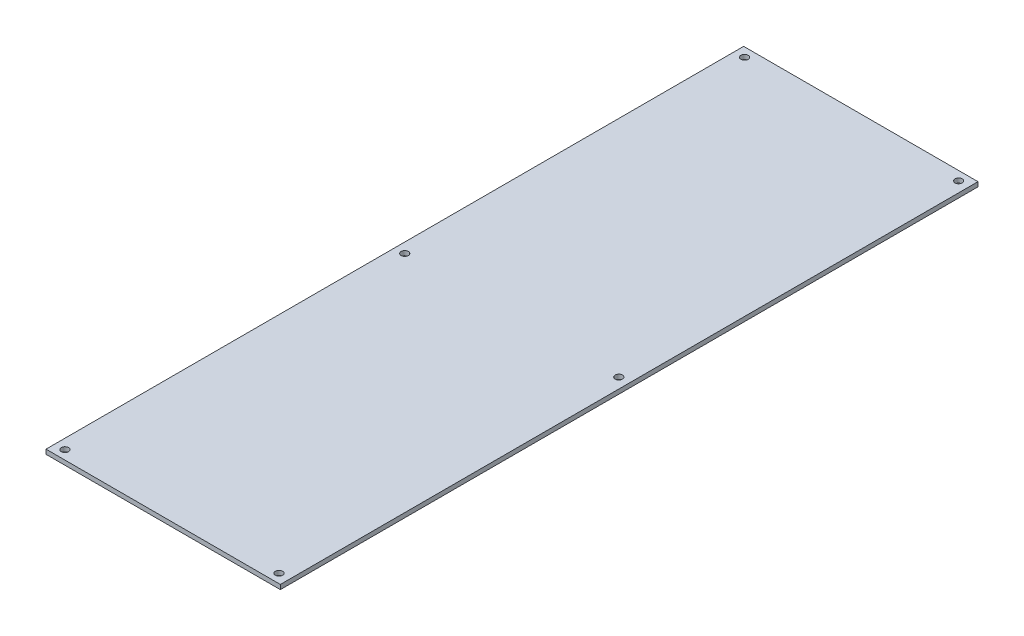
ISO-10303-21;
HEADER;
FILE_DESCRIPTION(('STEP AP214'),'2;1');
FILE_NAME('part.step','',(''),(''),'','','');
FILE_SCHEMA(('AUTOMOTIVE_DESIGN { 1 0 10303 214 1 1 1 1 }'));
ENDSEC;
DATA;
#1=APPLICATION_CONTEXT('core data for automotive mechanical design processes');
#2=APPLICATION_PROTOCOL_DEFINITION('international standard','automotive_design',2000,#1);
#3=PRODUCT_CONTEXT('',#1,'mechanical');
#4=PRODUCT('Part','Part','',(#3));
#5=PRODUCT_RELATED_PRODUCT_CATEGORY('part','',(#4));
#6=PRODUCT_DEFINITION_FORMATION('','',#4);
#7=PRODUCT_DEFINITION_CONTEXT('part definition',#1,'design');
#8=PRODUCT_DEFINITION('design','',#6,#7);
#9=PRODUCT_DEFINITION_SHAPE('','',#8);
#10=(LENGTH_UNIT() NAMED_UNIT(*) SI_UNIT(.MILLI.,.METRE.));
#11=(NAMED_UNIT(*) PLANE_ANGLE_UNIT() SI_UNIT($,.RADIAN.));
#12=(NAMED_UNIT(*) SI_UNIT($,.STERADIAN.) SOLID_ANGLE_UNIT());
#13=UNCERTAINTY_MEASURE_WITH_UNIT(LENGTH_MEASURE(1.E-05),#10,'distance_accuracy_value','');
#14=(GEOMETRIC_REPRESENTATION_CONTEXT(3) GLOBAL_UNCERTAINTY_ASSIGNED_CONTEXT((#13)) GLOBAL_UNIT_ASSIGNED_CONTEXT((#10,
#11,#12)) REPRESENTATION_CONTEXT('',''));
#15=CARTESIAN_POINT('',(0.,0.,0.));
#16=DIRECTION('',(0.,0.,1.));
#17=DIRECTION('',(1.,0.,0.));
#18=AXIS2_PLACEMENT_3D('',#15,#16,#17);
#19=CARTESIAN_POINT('',(0.,0.,0.));
#20=DIRECTION('',(0.,1.,0.));
#21=DIRECTION('',(0.,0.,1.));
#22=AXIS2_PLACEMENT_3D('',#19,#20,#21);
#23=PLANE('',#22);
#24=CARTESIAN_POINT('',(118.5,0.,-377.));
#25=DIRECTION('',(0.,-1.,0.));
#26=DIRECTION('',(0.,0.,-1.));
#27=AXIS2_PLACEMENT_3D('',#24,#25,#26);
#28=CIRCLE('',#27,4.00000000000001);
#29=CARTESIAN_POINT('',(118.5,0.,-381.));
#30=VERTEX_POINT('',#29);
#31=EDGE_CURVE('E194',#30,#30,#28,.T.);
#32=ORIENTED_EDGE('',*,*,#31,.F.);
#33=EDGE_LOOP('',(#32));
#34=FACE_BOUND('',#33,.T.);
#35=CARTESIAN_POINT('',(-119.000000000001,0.,0.));
#36=DIRECTION('',(0.,-1.,0.));
#37=DIRECTION('',(0.,0.,-1.));
#38=AXIS2_PLACEMENT_3D('',#35,#36,#37);
#39=CIRCLE('',#38,4.00000000000001);
#40=CARTESIAN_POINT('',(-119.000000000001,0.,-3.99999999999995));
#41=VERTEX_POINT('',#40);
#42=EDGE_CURVE('E197',#41,#41,#39,.T.);
#43=ORIENTED_EDGE('',*,*,#42,.F.);
#44=EDGE_LOOP('',(#43));
#45=FACE_BOUND('',#44,.T.);
#46=CARTESIAN_POINT('',(118.499999999999,0.,0.));
#47=DIRECTION('',(0.,-1.,0.));
#48=DIRECTION('',(0.,0.,-1.));
#49=AXIS2_PLACEMENT_3D('',#46,#47,#48);
#50=CIRCLE('',#49,4.00000000000001);
#51=CARTESIAN_POINT('',(118.499999999999,0.,-4.00000000000001));
#52=VERTEX_POINT('',#51);
#53=EDGE_CURVE('E201',#52,#52,#50,.T.);
#54=ORIENTED_EDGE('',*,*,#53,.F.);
#55=EDGE_LOOP('',(#54));
#56=FACE_BOUND('',#55,.T.);
#57=CARTESIAN_POINT('',(118.499999999999,0.,377.000000000001));
#58=DIRECTION('',(0.,-1.,0.));
#59=DIRECTION('',(0.,0.,-1.));
#60=AXIS2_PLACEMENT_3D('',#57,#58,#59);
#61=CIRCLE('',#60,4.00000000000001);
#62=CARTESIAN_POINT('',(118.499999999999,0.,373.000000000001));
#63=VERTEX_POINT('',#62);
#64=EDGE_CURVE('E203',#63,#63,#61,.T.);
#65=ORIENTED_EDGE('',*,*,#64,.F.);
#66=EDGE_LOOP('',(#65));
#67=FACE_BOUND('',#66,.T.);
#68=CARTESIAN_POINT('',(-119.000000000001,0.,-376.999999999997));
#69=DIRECTION('',(0.,-1.,0.));
#70=DIRECTION('',(0.,0.,-1.));
#71=AXIS2_PLACEMENT_3D('',#68,#69,#70);
#72=CIRCLE('',#71,4.00000000000001);
#73=CARTESIAN_POINT('',(-119.000000000001,0.,-380.999999999997));
#74=VERTEX_POINT('',#73);
#75=EDGE_CURVE('E192',#74,#74,#72,.T.);
#76=ORIENTED_EDGE('',*,*,#75,.F.);
#77=EDGE_LOOP('',(#76));
#78=FACE_BOUND('',#77,.T.);
#79=CARTESIAN_POINT('',(-119.000000000002,0.,377.000000000001));
#80=DIRECTION('',(0.,-1.,0.));
#81=DIRECTION('',(0.,0.,-1.));
#82=AXIS2_PLACEMENT_3D('',#79,#80,#81);
#83=CIRCLE('',#82,4.00000000000001);
#84=CARTESIAN_POINT('',(-119.000000000002,0.,373.000000000001));
#85=VERTEX_POINT('',#84);
#86=EDGE_CURVE('E114',#85,#85,#83,.T.);
#87=ORIENTED_EDGE('',*,*,#86,.F.);
#88=EDGE_LOOP('',(#87));
#89=FACE_BOUND('',#88,.T.);
#90=DIRECTION('',(0.,0.,1.));
#91=VECTOR('',#90,1.);
#92=CARTESIAN_POINT('',(130.000000000002,0.,-387.));
#93=LINE('',#92,#91);
#94=CARTESIAN_POINT('',(130.000000000001,0.,-387.000000000001));
#95=VERTEX_POINT('',#94);
#96=CARTESIAN_POINT('',(130.000000000001,0.,386.999999999999));
#97=VERTEX_POINT('',#96);
#98=EDGE_CURVE('E94',#95,#97,#93,.T.);
#99=ORIENTED_EDGE('',*,*,#98,.T.);
#100=DIRECTION('',(-1.,0.,0.));
#101=VECTOR('',#100,1.);
#102=CARTESIAN_POINT('',(-130.000000000001,0.,386.999999999999));
#103=LINE('',#102,#101);
#104=CARTESIAN_POINT('',(-130.,0.,386.999999999999));
#105=VERTEX_POINT('',#104);
#106=EDGE_CURVE('E85',#97,#105,#103,.T.);
#107=ORIENTED_EDGE('',*,*,#106,.T.);
#108=DIRECTION('',(0.,0.,-1.));
#109=VECTOR('',#108,1.);
#110=CARTESIAN_POINT('',(-130.,0.,-387.));
#111=LINE('',#110,#109);
#112=CARTESIAN_POINT('',(-130.,0.,-387.));
#113=VERTEX_POINT('',#112);
#114=EDGE_CURVE('E106',#105,#113,#111,.T.);
#115=ORIENTED_EDGE('',*,*,#114,.T.);
#116=DIRECTION('',(1.,0.,0.));
#117=VECTOR('',#116,1.);
#118=CARTESIAN_POINT('',(-130.,0.,-387.));
#119=LINE('',#118,#117);
#120=EDGE_CURVE('E82',#113,#95,#119,.T.);
#121=ORIENTED_EDGE('',*,*,#120,.T.);
#122=EDGE_LOOP('',(#99,#107,#115,#121));
#123=FACE_BOUND('',#122,.T.);
#124=ADVANCED_FACE('F44',(#34,#45,#56,#67,#78,#89,#123),#23,.F.);
#125=CARTESIAN_POINT('',(130.000000000002,5.,-387.));
#126=DIRECTION('',(-1.,0.,0.));
#127=DIRECTION('',(0.,0.,1.));
#128=AXIS2_PLACEMENT_3D('',#125,#126,#127);
#129=PLANE('',#128);
#130=DIRECTION('',(0.,0.,1.));
#131=VECTOR('',#130,1.);
#132=CARTESIAN_POINT('',(130.,5.,0.));
#133=LINE('',#132,#131);
#134=CARTESIAN_POINT('',(130.,5.,386.999999999999));
#135=VERTEX_POINT('',#134);
#136=CARTESIAN_POINT('',(130.,5.,-387.000000000001));
#137=VERTEX_POINT('',#136);
#138=EDGE_CURVE('E100',#135,#137,#133,.F.);
#139=ORIENTED_EDGE('',*,*,#138,.F.);
#140=DIRECTION('',(0.,1.,0.));
#141=VECTOR('',#140,1.);
#142=CARTESIAN_POINT('',(130.000000000001,5.,387.));
#143=LINE('',#142,#141);
#144=EDGE_CURVE('E88',#97,#135,#143,.T.);
#145=ORIENTED_EDGE('',*,*,#144,.F.);
#146=ORIENTED_EDGE('',*,*,#98,.F.);
#147=DIRECTION('',(0.,1.,0.));
#148=VECTOR('',#147,1.);
#149=CARTESIAN_POINT('',(130.000000000001,5.,-387.000000000001));
#150=LINE('',#149,#148);
#151=EDGE_CURVE('E101',#95,#137,#150,.T.);
#152=ORIENTED_EDGE('',*,*,#151,.T.);
#153=EDGE_LOOP('',(#139,#145,#146,#152));
#154=FACE_BOUND('',#153,.T.);
#155=ADVANCED_FACE('F98',(#154),#129,.F.);
#156=CARTESIAN_POINT('',(-130.,5.,-387.));
#157=DIRECTION('',(0.,0.,1.));
#158=DIRECTION('',(1.,0.,0.));
#159=AXIS2_PLACEMENT_3D('',#156,#157,#158);
#160=PLANE('',#159);
#161=ORIENTED_EDGE('',*,*,#120,.F.);
#162=DIRECTION('',(0.,1.,0.));
#163=VECTOR('',#162,1.);
#164=CARTESIAN_POINT('',(-130.,5.,-387.));
#165=LINE('',#164,#163);
#166=CARTESIAN_POINT('',(-130.,5.,-387.));
#167=VERTEX_POINT('',#166);
#168=EDGE_CURVE('E92',#113,#167,#165,.T.);
#169=ORIENTED_EDGE('',*,*,#168,.T.);
#170=DIRECTION('',(1.,0.,0.));
#171=VECTOR('',#170,1.);
#172=CARTESIAN_POINT('',(0.,5.,-387.000000000001));
#173=LINE('',#172,#171);
#174=EDGE_CURVE('E53',#137,#167,#173,.F.);
#175=ORIENTED_EDGE('',*,*,#174,.F.);
#176=ORIENTED_EDGE('',*,*,#151,.F.);
#177=EDGE_LOOP('',(#161,#169,#175,#176));
#178=FACE_BOUND('',#177,.T.);
#179=ADVANCED_FACE('F157',(#178),#160,.F.);
#180=CARTESIAN_POINT('',(-130.,5.,-387.));
#181=DIRECTION('',(1.,0.,0.));
#182=DIRECTION('',(0.,0.,-1.));
#183=AXIS2_PLACEMENT_3D('',#180,#181,#182);
#184=PLANE('',#183);
#185=DIRECTION('',(0.,0.,1.));
#186=VECTOR('',#185,1.);
#187=CARTESIAN_POINT('',(-130.,5.,0.));
#188=LINE('',#187,#186);
#189=CARTESIAN_POINT('',(-130.,5.,386.999999999999));
#190=VERTEX_POINT('',#189);
#191=EDGE_CURVE('E11',#167,#190,#188,.T.);
#192=ORIENTED_EDGE('',*,*,#191,.F.);
#193=ORIENTED_EDGE('',*,*,#168,.F.);
#194=ORIENTED_EDGE('',*,*,#114,.F.);
#195=DIRECTION('',(0.,1.,0.));
#196=VECTOR('',#195,1.);
#197=CARTESIAN_POINT('',(-130.,5.,386.999999999999));
#198=LINE('',#197,#196);
#199=EDGE_CURVE('E90',#105,#190,#198,.T.);
#200=ORIENTED_EDGE('',*,*,#199,.T.);
#201=EDGE_LOOP('',(#192,#193,#194,#200));
#202=FACE_BOUND('',#201,.T.);
#203=ADVANCED_FACE('F151',(#202),#184,.F.);
#204=CARTESIAN_POINT('',(-130.000000000001,5.,386.999999999999));
#205=DIRECTION('',(0.,0.,-1.));
#206=DIRECTION('',(-1.,0.,0.));
#207=AXIS2_PLACEMENT_3D('',#204,#205,#206);
#208=PLANE('',#207);
#209=DIRECTION('',(1.,0.,0.));
#210=VECTOR('',#209,1.);
#211=CARTESIAN_POINT('',(0.,5.,386.999999999999));
#212=LINE('',#211,#210);
#213=EDGE_CURVE('E62',#190,#135,#212,.T.);
#214=ORIENTED_EDGE('',*,*,#213,.F.);
#215=ORIENTED_EDGE('',*,*,#199,.F.);
#216=ORIENTED_EDGE('',*,*,#106,.F.);
#217=ORIENTED_EDGE('',*,*,#144,.T.);
#218=EDGE_LOOP('',(#214,#215,#216,#217));
#219=FACE_BOUND('',#218,.T.);
#220=ADVANCED_FACE('F86',(#219),#208,.F.);
#221=CARTESIAN_POINT('',(0.,5.,0.));
#222=DIRECTION('',(0.,1.,0.));
#223=DIRECTION('',(0.,0.,1.));
#224=AXIS2_PLACEMENT_3D('',#221,#222,#223);
#225=PLANE('',#224);
#226=CARTESIAN_POINT('',(118.5,5.,-377.));
#227=DIRECTION('',(0.,1.,0.));
#228=DIRECTION('',(0.,0.,1.));
#229=AXIS2_PLACEMENT_3D('',#226,#227,#228);
#230=CIRCLE('',#229,4.00000000000001);
#231=CARTESIAN_POINT('',(118.5,5.,-373.));
#232=VERTEX_POINT('',#231);
#233=EDGE_CURVE('E47',#232,#232,#230,.T.);
#234=ORIENTED_EDGE('',*,*,#233,.F.);
#235=EDGE_LOOP('',(#234));
#236=FACE_BOUND('',#235,.T.);
#237=CARTESIAN_POINT('',(-119.000000000001,5.,0.));
#238=DIRECTION('',(0.,1.,0.));
#239=DIRECTION('',(0.,0.,1.));
#240=AXIS2_PLACEMENT_3D('',#237,#238,#239);
#241=CIRCLE('',#240,4.00000000000001);
#242=CARTESIAN_POINT('',(-119.000000000001,5.,4.00000000000006));
#243=VERTEX_POINT('',#242);
#244=EDGE_CURVE('E122',#243,#243,#241,.T.);
#245=ORIENTED_EDGE('',*,*,#244,.F.);
#246=EDGE_LOOP('',(#245));
#247=FACE_BOUND('',#246,.T.);
#248=CARTESIAN_POINT('',(118.499999999999,5.,0.));
#249=DIRECTION('',(0.,1.,0.));
#250=DIRECTION('',(0.,0.,1.));
#251=AXIS2_PLACEMENT_3D('',#248,#249,#250);
#252=CIRCLE('',#251,4.00000000000001);
#253=CARTESIAN_POINT('',(118.499999999999,5.,4.00000000000001));
#254=VERTEX_POINT('',#253);
#255=EDGE_CURVE('E120',#254,#254,#252,.T.);
#256=ORIENTED_EDGE('',*,*,#255,.F.);
#257=EDGE_LOOP('',(#256));
#258=FACE_BOUND('',#257,.T.);
#259=CARTESIAN_POINT('',(118.499999999999,5.,377.000000000001));
#260=DIRECTION('',(0.,1.,0.));
#261=DIRECTION('',(0.,0.,1.));
#262=AXIS2_PLACEMENT_3D('',#259,#260,#261);
#263=CIRCLE('',#262,4.00000000000001);
#264=CARTESIAN_POINT('',(118.499999999999,5.,381.000000000001));
#265=VERTEX_POINT('',#264);
#266=EDGE_CURVE('E117',#265,#265,#263,.T.);
#267=ORIENTED_EDGE('',*,*,#266,.F.);
#268=EDGE_LOOP('',(#267));
#269=FACE_BOUND('',#268,.T.);
#270=CARTESIAN_POINT('',(-119.000000000001,5.,-376.999999999997));
#271=DIRECTION('',(0.,1.,0.));
#272=DIRECTION('',(0.,0.,1.));
#273=AXIS2_PLACEMENT_3D('',#270,#271,#272);
#274=CIRCLE('',#273,4.00000000000001);
#275=CARTESIAN_POINT('',(-119.000000000001,5.,-372.999999999997));
#276=VERTEX_POINT('',#275);
#277=EDGE_CURVE('E113',#276,#276,#274,.T.);
#278=ORIENTED_EDGE('',*,*,#277,.F.);
#279=EDGE_LOOP('',(#278));
#280=FACE_BOUND('',#279,.T.);
#281=CARTESIAN_POINT('',(-119.000000000002,5.,377.000000000001));
#282=DIRECTION('',(0.,1.,0.));
#283=DIRECTION('',(0.,0.,1.));
#284=AXIS2_PLACEMENT_3D('',#281,#282,#283);
#285=CIRCLE('',#284,4.00000000000001);
#286=CARTESIAN_POINT('',(-119.000000000002,5.,381.000000000001));
#287=VERTEX_POINT('',#286);
#288=EDGE_CURVE('E110',#287,#287,#285,.T.);
#289=ORIENTED_EDGE('',*,*,#288,.F.);
#290=EDGE_LOOP('',(#289));
#291=FACE_BOUND('',#290,.T.);
#292=ORIENTED_EDGE('',*,*,#191,.T.);
#293=ORIENTED_EDGE('',*,*,#213,.T.);
#294=ORIENTED_EDGE('',*,*,#138,.T.);
#295=ORIENTED_EDGE('',*,*,#174,.T.);
#296=EDGE_LOOP('',(#292,#293,#294,#295));
#297=FACE_BOUND('',#296,.T.);
#298=ADVANCED_FACE('F132',(#236,#247,#258,#269,#280,#291,#297),#225,.T.);
#299=CARTESIAN_POINT('',(-119.000000000002,10.,377.000000000001));
#300=DIRECTION('',(0.,-1.,0.));
#301=DIRECTION('',(0.,0.,-1.));
#302=AXIS2_PLACEMENT_3D('',#299,#300,#301);
#303=CYLINDRICAL_SURFACE('',#302,4.00000000000001);
#304=ORIENTED_EDGE('',*,*,#288,.T.);
#305=EDGE_LOOP('',(#304));
#306=FACE_BOUND('',#305,.T.);
#307=ORIENTED_EDGE('',*,*,#86,.T.);
#308=EDGE_LOOP('',(#307));
#309=FACE_BOUND('',#308,.T.);
#310=ADVANCED_FACE('F135',(#306,#309),#303,.F.);
#311=CARTESIAN_POINT('',(-119.000000000001,10.,-376.999999999997));
#312=DIRECTION('',(0.,-1.,0.));
#313=DIRECTION('',(0.,0.,-1.));
#314=AXIS2_PLACEMENT_3D('',#311,#312,#313);
#315=CYLINDRICAL_SURFACE('',#314,4.00000000000001);
#316=ORIENTED_EDGE('',*,*,#277,.T.);
#317=EDGE_LOOP('',(#316));
#318=FACE_BOUND('',#317,.T.);
#319=ORIENTED_EDGE('',*,*,#75,.T.);
#320=EDGE_LOOP('',(#319));
#321=FACE_BOUND('',#320,.T.);
#322=ADVANCED_FACE('F170',(#318,#321),#315,.F.);
#323=CARTESIAN_POINT('',(118.499999999999,10.,377.000000000001));
#324=DIRECTION('',(0.,-1.,0.));
#325=DIRECTION('',(0.,0.,-1.));
#326=AXIS2_PLACEMENT_3D('',#323,#324,#325);
#327=CYLINDRICAL_SURFACE('',#326,4.00000000000001);
#328=ORIENTED_EDGE('',*,*,#266,.T.);
#329=EDGE_LOOP('',(#328));
#330=FACE_BOUND('',#329,.T.);
#331=ORIENTED_EDGE('',*,*,#64,.T.);
#332=EDGE_LOOP('',(#331));
#333=FACE_BOUND('',#332,.T.);
#334=ADVANCED_FACE('F176',(#330,#333),#327,.F.);
#335=CARTESIAN_POINT('',(118.499999999999,10.,0.));
#336=DIRECTION('',(0.,-1.,0.));
#337=DIRECTION('',(0.,0.,-1.));
#338=AXIS2_PLACEMENT_3D('',#335,#336,#337);
#339=CYLINDRICAL_SURFACE('',#338,4.00000000000001);
#340=ORIENTED_EDGE('',*,*,#255,.T.);
#341=EDGE_LOOP('',(#340));
#342=FACE_BOUND('',#341,.T.);
#343=ORIENTED_EDGE('',*,*,#53,.T.);
#344=EDGE_LOOP('',(#343));
#345=FACE_BOUND('',#344,.T.);
#346=ADVANCED_FACE('F172',(#342,#345),#339,.F.);
#347=CARTESIAN_POINT('',(-119.000000000001,10.,0.));
#348=DIRECTION('',(0.,-1.,0.));
#349=DIRECTION('',(0.,0.,-1.));
#350=AXIS2_PLACEMENT_3D('',#347,#348,#349);
#351=CYLINDRICAL_SURFACE('',#350,4.00000000000001);
#352=ORIENTED_EDGE('',*,*,#244,.T.);
#353=EDGE_LOOP('',(#352));
#354=FACE_BOUND('',#353,.T.);
#355=ORIENTED_EDGE('',*,*,#42,.T.);
#356=EDGE_LOOP('',(#355));
#357=FACE_BOUND('',#356,.T.);
#358=ADVANCED_FACE('F175',(#354,#357),#351,.F.);
#359=CARTESIAN_POINT('',(118.5,10.,-377.));
#360=DIRECTION('',(0.,-1.,0.));
#361=DIRECTION('',(0.,0.,-1.));
#362=AXIS2_PLACEMENT_3D('',#359,#360,#361);
#363=CYLINDRICAL_SURFACE('',#362,4.00000000000001);
#364=ORIENTED_EDGE('',*,*,#233,.T.);
#365=EDGE_LOOP('',(#364));
#366=FACE_BOUND('',#365,.T.);
#367=ORIENTED_EDGE('',*,*,#31,.T.);
#368=EDGE_LOOP('',(#367));
#369=FACE_BOUND('',#368,.T.);
#370=ADVANCED_FACE('F129',(#366,#369),#363,.F.);
#371=CLOSED_SHELL('',(#124,#155,#179,#203,#220,#298,#310,#322,#334,#346,#358,#370));
#372=MANIFOLD_SOLID_BREP('B2',#371);
#373=ADVANCED_BREP_SHAPE_REPRESENTATION('',(#18,#372),#14);
#374=SHAPE_DEFINITION_REPRESENTATION(#9,#373);
ENDSEC;
END-ISO-10303-21;
